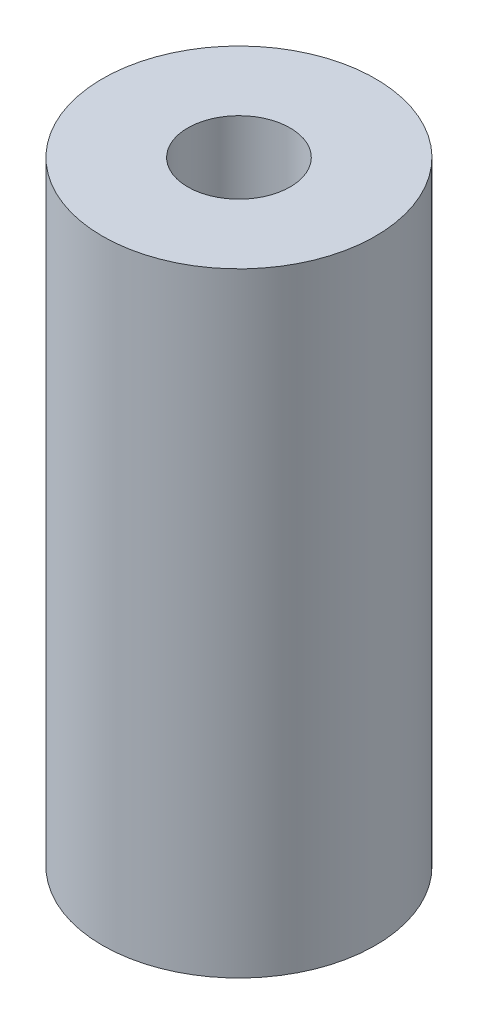
ISO-10303-21;
HEADER;
FILE_DESCRIPTION(('STEP AP214'),'2;1');
FILE_NAME('part.step','',(''),(''),'','','');
FILE_SCHEMA(('AUTOMOTIVE_DESIGN { 1 0 10303 214 1 1 1 1 }'));
ENDSEC;
DATA;
#1=APPLICATION_CONTEXT('core data for automotive mechanical design processes');
#2=APPLICATION_PROTOCOL_DEFINITION('international standard','automotive_design',2000,#1);
#3=PRODUCT_CONTEXT('',#1,'mechanical');
#4=PRODUCT('Part','Part','',(#3));
#5=PRODUCT_RELATED_PRODUCT_CATEGORY('part','',(#4));
#6=PRODUCT_DEFINITION_FORMATION('','',#4);
#7=PRODUCT_DEFINITION_CONTEXT('part definition',#1,'design');
#8=PRODUCT_DEFINITION('design','',#6,#7);
#9=PRODUCT_DEFINITION_SHAPE('','',#8);
#10=(LENGTH_UNIT() NAMED_UNIT(*) SI_UNIT(.MILLI.,.METRE.));
#11=(NAMED_UNIT(*) PLANE_ANGLE_UNIT() SI_UNIT($,.RADIAN.));
#12=(NAMED_UNIT(*) SI_UNIT($,.STERADIAN.) SOLID_ANGLE_UNIT());
#13=UNCERTAINTY_MEASURE_WITH_UNIT(LENGTH_MEASURE(1.E-05),#10,'distance_accuracy_value','');
#14=(GEOMETRIC_REPRESENTATION_CONTEXT(3) GLOBAL_UNCERTAINTY_ASSIGNED_CONTEXT((#13)) GLOBAL_UNIT_ASSIGNED_CONTEXT((#10,
#11,#12)) REPRESENTATION_CONTEXT('',''));
#15=CARTESIAN_POINT('',(0.,0.,0.));
#16=DIRECTION('',(0.,0.,1.));
#17=DIRECTION('',(1.,0.,0.));
#18=AXIS2_PLACEMENT_3D('',#15,#16,#17);
#19=CARTESIAN_POINT('',(0.,18.,0.));
#20=DIRECTION('',(0.,1.,0.));
#21=DIRECTION('',(0.,0.,1.));
#22=AXIS2_PLACEMENT_3D('',#19,#20,#21);
#23=PLANE('',#22);
#24=CARTESIAN_POINT('',(0.,18.,0.));
#25=DIRECTION('',(0.,1.,0.));
#26=DIRECTION('',(0.,0.,1.));
#27=AXIS2_PLACEMENT_3D('',#24,#25,#26);
#28=CIRCLE('',#27,4.);
#29=CARTESIAN_POINT('',(0.,18.,4.));
#30=VERTEX_POINT('',#29);
#31=EDGE_CURVE('E10',#30,#30,#28,.T.);
#32=ORIENTED_EDGE('',*,*,#31,.T.);
#33=EDGE_LOOP('',(#32));
#34=FACE_BOUND('',#33,.T.);
#35=CARTESIAN_POINT('',(0.,18.,0.));
#36=DIRECTION('',(0.,1.,0.));
#37=DIRECTION('',(0.,0.,1.));
#38=AXIS2_PLACEMENT_3D('',#35,#36,#37);
#39=CIRCLE('',#38,1.5);
#40=CARTESIAN_POINT('',(0.,18.,1.5));
#41=VERTEX_POINT('',#40);
#42=EDGE_CURVE('E41',#41,#41,#39,.T.);
#43=ORIENTED_EDGE('',*,*,#42,.F.);
#44=EDGE_LOOP('',(#43));
#45=FACE_BOUND('',#44,.T.);
#46=ADVANCED_FACE('F30',(#34,#45),#23,.T.);
#47=CARTESIAN_POINT('',(0.,0.,0.));
#48=DIRECTION('',(0.,1.,0.));
#49=DIRECTION('',(0.,0.,1.));
#50=AXIS2_PLACEMENT_3D('',#47,#48,#49);
#51=PLANE('',#50);
#52=CARTESIAN_POINT('',(0.,0.,0.));
#53=DIRECTION('',(0.,1.,0.));
#54=DIRECTION('',(0.,0.,1.));
#55=AXIS2_PLACEMENT_3D('',#52,#53,#54);
#56=CIRCLE('',#55,4.);
#57=CARTESIAN_POINT('',(0.,0.,4.));
#58=VERTEX_POINT('',#57);
#59=EDGE_CURVE('E34',#58,#58,#56,.T.);
#60=ORIENTED_EDGE('',*,*,#59,.F.);
#61=EDGE_LOOP('',(#60));
#62=FACE_BOUND('',#61,.T.);
#63=CARTESIAN_POINT('',(0.,0.,0.));
#64=DIRECTION('',(0.,1.,0.));
#65=DIRECTION('',(0.,0.,1.));
#66=AXIS2_PLACEMENT_3D('',#63,#64,#65);
#67=CIRCLE('',#66,1.5);
#68=CARTESIAN_POINT('',(0.,0.,1.5));
#69=VERTEX_POINT('',#68);
#70=EDGE_CURVE('E43',#69,#69,#67,.T.);
#71=ORIENTED_EDGE('',*,*,#70,.T.);
#72=EDGE_LOOP('',(#71));
#73=FACE_BOUND('',#72,.T.);
#74=ADVANCED_FACE('F53',(#62,#73),#51,.F.);
#75=CARTESIAN_POINT('',(0.,18.,0.));
#76=DIRECTION('',(0.,-1.,0.));
#77=DIRECTION('',(0.,0.,-1.));
#78=AXIS2_PLACEMENT_3D('',#75,#76,#77);
#79=CYLINDRICAL_SURFACE('',#78,4.);
#80=ORIENTED_EDGE('',*,*,#31,.F.);
#81=EDGE_LOOP('',(#80));
#82=FACE_BOUND('',#81,.T.);
#83=ORIENTED_EDGE('',*,*,#59,.T.);
#84=EDGE_LOOP('',(#83));
#85=FACE_BOUND('',#84,.T.);
#86=ADVANCED_FACE('F32',(#82,#85),#79,.T.);
#87=CARTESIAN_POINT('',(0.,18.,0.));
#88=DIRECTION('',(0.,-1.,0.));
#89=DIRECTION('',(0.,0.,-1.));
#90=AXIS2_PLACEMENT_3D('',#87,#88,#89);
#91=CYLINDRICAL_SURFACE('',#90,1.5);
#92=ORIENTED_EDGE('',*,*,#42,.T.);
#93=EDGE_LOOP('',(#92));
#94=FACE_BOUND('',#93,.T.);
#95=ORIENTED_EDGE('',*,*,#70,.F.);
#96=EDGE_LOOP('',(#95));
#97=FACE_BOUND('',#96,.T.);
#98=ADVANCED_FACE('F49',(#94,#97),#91,.F.);
#99=CLOSED_SHELL('',(#46,#74,#86,#98));
#100=MANIFOLD_SOLID_BREP('B2',#99);
#101=ADVANCED_BREP_SHAPE_REPRESENTATION('',(#18,#100),#14);
#102=SHAPE_DEFINITION_REPRESENTATION(#9,#101);
ENDSEC;
END-ISO-10303-21;
